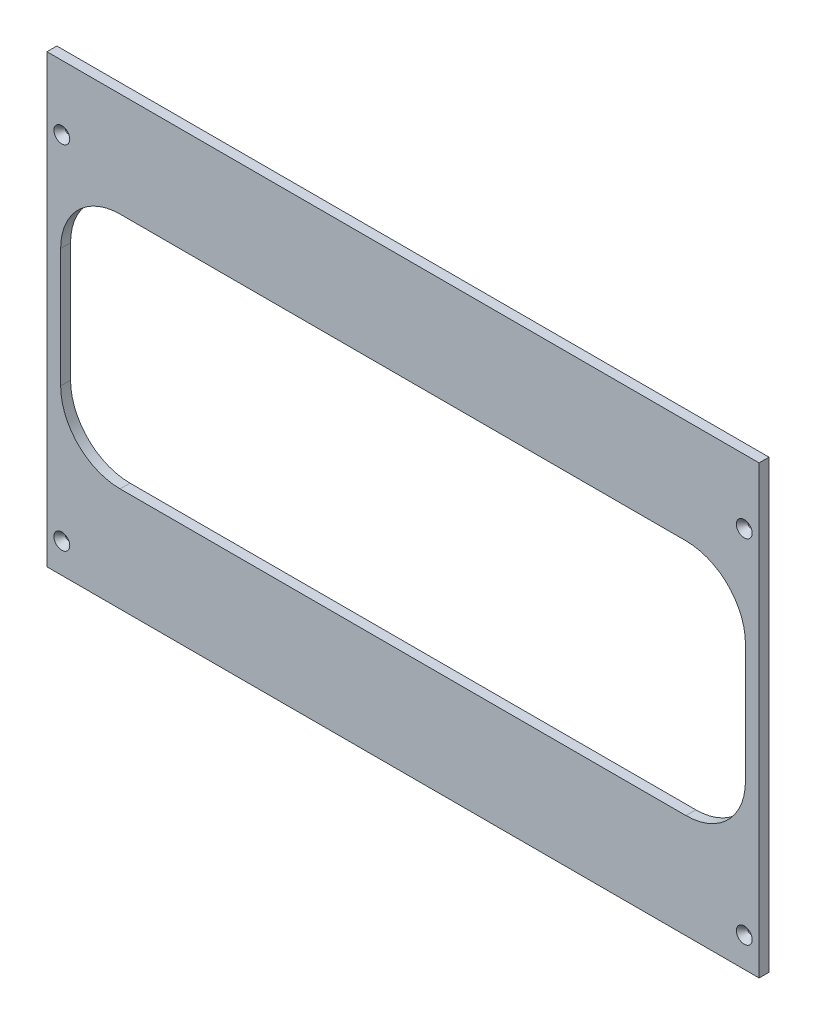
ISO-10303-21;
HEADER;
FILE_DESCRIPTION(('STEP AP214'),'2;1');
FILE_NAME('part.step','',(''),(''),'','','');
FILE_SCHEMA(('AUTOMOTIVE_DESIGN { 1 0 10303 214 1 1 1 1 }'));
ENDSEC;
DATA;
#1=APPLICATION_CONTEXT('core data for automotive mechanical design processes');
#2=APPLICATION_PROTOCOL_DEFINITION('international standard','automotive_design',2000,#1);
#3=PRODUCT_CONTEXT('',#1,'mechanical');
#4=PRODUCT('Part','Part','',(#3));
#5=PRODUCT_RELATED_PRODUCT_CATEGORY('part','',(#4));
#6=PRODUCT_DEFINITION_FORMATION('','',#4);
#7=PRODUCT_DEFINITION_CONTEXT('part definition',#1,'design');
#8=PRODUCT_DEFINITION('design','',#6,#7);
#9=PRODUCT_DEFINITION_SHAPE('','',#8);
#10=(LENGTH_UNIT() NAMED_UNIT(*) SI_UNIT(.MILLI.,.METRE.));
#11=(NAMED_UNIT(*) PLANE_ANGLE_UNIT() SI_UNIT($,.RADIAN.));
#12=(NAMED_UNIT(*) SI_UNIT($,.STERADIAN.) SOLID_ANGLE_UNIT());
#13=UNCERTAINTY_MEASURE_WITH_UNIT(LENGTH_MEASURE(1.E-05),#10,'distance_accuracy_value','');
#14=(GEOMETRIC_REPRESENTATION_CONTEXT(3) GLOBAL_UNCERTAINTY_ASSIGNED_CONTEXT((#13)) GLOBAL_UNIT_ASSIGNED_CONTEXT((#10,
#11,#12)) REPRESENTATION_CONTEXT('',''));
#15=CARTESIAN_POINT('',(0.,0.,0.));
#16=DIRECTION('',(0.,0.,1.));
#17=DIRECTION('',(1.,0.,0.));
#18=AXIS2_PLACEMENT_3D('',#15,#16,#17);
#19=CARTESIAN_POINT('',(-228.088766336441,1.74426445509468E-12,6.35));
#20=DIRECTION('',(1.,0.,0.));
#21=DIRECTION('',(0.,1.,0.));
#22=AXIS2_PLACEMENT_3D('',#19,#20,#21);
#23=PLANE('',#22);
#24=DIRECTION('',(0.,-1.,0.));
#25=VECTOR('',#24,1.);
#26=CARTESIAN_POINT('',(-228.088766336441,1.74426445509468E-12,0.));
#27=LINE('',#26,#25);
#28=CARTESIAN_POINT('',(-228.088766336441,1.74426445509468E-12,0.));
#29=VERTEX_POINT('',#28);
#30=CARTESIAN_POINT('',(-228.088766336441,-285.75,0.));
#31=VERTEX_POINT('',#30);
#32=EDGE_CURVE('E147',#29,#31,#27,.T.);
#33=ORIENTED_EDGE('',*,*,#32,.T.);
#34=DIRECTION('',(0.,0.,-1.));
#35=VECTOR('',#34,1.);
#36=CARTESIAN_POINT('',(-228.088766336441,-285.75,6.35));
#37=LINE('',#36,#35);
#38=CARTESIAN_POINT('',(-228.088766336441,-285.75,6.35));
#39=VERTEX_POINT('',#38);
#40=EDGE_CURVE('E128',#39,#31,#37,.T.);
#41=ORIENTED_EDGE('',*,*,#40,.F.);
#42=DIRECTION('',(0.,-1.,0.));
#43=VECTOR('',#42,1.);
#44=CARTESIAN_POINT('',(-228.088766336441,1.74426445509468E-12,6.35));
#45=LINE('',#44,#43);
#46=CARTESIAN_POINT('',(-228.088766336441,1.74426445509468E-12,6.35));
#47=VERTEX_POINT('',#46);
#48=EDGE_CURVE('E135',#47,#39,#45,.T.);
#49=ORIENTED_EDGE('',*,*,#48,.F.);
#50=DIRECTION('',(0.,0.,-1.));
#51=VECTOR('',#50,1.);
#52=CARTESIAN_POINT('',(-228.088766336441,1.74426445509468E-12,6.35));
#53=LINE('',#52,#51);
#54=EDGE_CURVE('E240',#47,#29,#53,.T.);
#55=ORIENTED_EDGE('',*,*,#54,.T.);
#56=EDGE_LOOP('',(#33,#41,#49,#55));
#57=FACE_BOUND('',#56,.T.);
#58=ADVANCED_FACE('F33',(#57),#23,.F.);
#59=CARTESIAN_POINT('',(-228.088766336441,-285.75,6.35));
#60=DIRECTION('',(0.,1.,0.));
#61=DIRECTION('',(0.,0.,1.));
#62=AXIS2_PLACEMENT_3D('',#59,#60,#61);
#63=PLANE('',#62);
#64=DIRECTION('',(1.,0.,0.));
#65=VECTOR('',#64,1.);
#66=CARTESIAN_POINT('',(-228.088766336441,-285.75,0.));
#67=LINE('',#66,#65);
#68=CARTESIAN_POINT('',(228.088766336441,-285.75,0.));
#69=VERTEX_POINT('',#68);
#70=EDGE_CURVE('E242',#31,#69,#67,.T.);
#71=ORIENTED_EDGE('',*,*,#70,.T.);
#72=DIRECTION('',(0.,0.,-1.));
#73=VECTOR('',#72,1.);
#74=CARTESIAN_POINT('',(228.088766336441,-285.75,6.35));
#75=LINE('',#74,#73);
#76=CARTESIAN_POINT('',(228.088766336441,-285.75,6.35));
#77=VERTEX_POINT('',#76);
#78=EDGE_CURVE('E131',#77,#69,#75,.T.);
#79=ORIENTED_EDGE('',*,*,#78,.F.);
#80=DIRECTION('',(1.,0.,0.));
#81=VECTOR('',#80,1.);
#82=CARTESIAN_POINT('',(-228.088766336441,-285.75,6.35));
#83=LINE('',#82,#81);
#84=EDGE_CURVE('E124',#39,#77,#83,.T.);
#85=ORIENTED_EDGE('',*,*,#84,.F.);
#86=ORIENTED_EDGE('',*,*,#40,.T.);
#87=EDGE_LOOP('',(#71,#79,#85,#86));
#88=FACE_BOUND('',#87,.T.);
#89=ADVANCED_FACE('F126',(#88),#63,.F.);
#90=CARTESIAN_POINT('',(228.088766336441,1.74426445509468E-12,6.35));
#91=DIRECTION('',(-1.,0.,0.));
#92=DIRECTION('',(0.,-1.,0.));
#93=AXIS2_PLACEMENT_3D('',#90,#91,#92);
#94=PLANE('',#93);
#95=DIRECTION('',(0.,1.,0.));
#96=VECTOR('',#95,1.);
#97=CARTESIAN_POINT('',(228.088766336441,1.74426445509468E-12,0.));
#98=LINE('',#97,#96);
#99=CARTESIAN_POINT('',(228.088766336441,1.74426445509468E-12,0.));
#100=VERTEX_POINT('',#99);
#101=EDGE_CURVE('E244',#69,#100,#98,.T.);
#102=ORIENTED_EDGE('',*,*,#101,.T.);
#103=DIRECTION('',(0.,0.,-1.));
#104=VECTOR('',#103,1.);
#105=CARTESIAN_POINT('',(228.088766336441,1.74426445509468E-12,6.35));
#106=LINE('',#105,#104);
#107=CARTESIAN_POINT('',(228.088766336441,1.74426445509468E-12,6.35));
#108=VERTEX_POINT('',#107);
#109=EDGE_CURVE('E152',#108,#100,#106,.T.);
#110=ORIENTED_EDGE('',*,*,#109,.F.);
#111=DIRECTION('',(0.,1.,0.));
#112=VECTOR('',#111,1.);
#113=CARTESIAN_POINT('',(228.088766336441,1.74426445509468E-12,6.35));
#114=LINE('',#113,#112);
#115=EDGE_CURVE('E134',#77,#108,#114,.T.);
#116=ORIENTED_EDGE('',*,*,#115,.F.);
#117=ORIENTED_EDGE('',*,*,#78,.T.);
#118=EDGE_LOOP('',(#102,#110,#116,#117));
#119=FACE_BOUND('',#118,.T.);
#120=ADVANCED_FACE('F256',(#119),#94,.F.);
#121=CARTESIAN_POINT('',(-228.088766336441,1.74426445509468E-12,6.35));
#122=DIRECTION('',(0.,-1.,0.));
#123=DIRECTION('',(0.,0.,-1.));
#124=AXIS2_PLACEMENT_3D('',#121,#122,#123);
#125=PLANE('',#124);
#126=DIRECTION('',(-1.,0.,0.));
#127=VECTOR('',#126,1.);
#128=CARTESIAN_POINT('',(-228.088766336441,1.74426445509468E-12,0.));
#129=LINE('',#128,#127);
#130=EDGE_CURVE('E144',#100,#29,#129,.T.);
#131=ORIENTED_EDGE('',*,*,#130,.T.);
#132=ORIENTED_EDGE('',*,*,#54,.F.);
#133=DIRECTION('',(-1.,0.,0.));
#134=VECTOR('',#133,1.);
#135=CARTESIAN_POINT('',(-228.088766336441,1.74426445509468E-12,6.35));
#136=LINE('',#135,#134);
#137=EDGE_CURVE('E140',#108,#47,#136,.T.);
#138=ORIENTED_EDGE('',*,*,#137,.F.);
#139=ORIENTED_EDGE('',*,*,#109,.T.);
#140=EDGE_LOOP('',(#131,#132,#138,#139));
#141=FACE_BOUND('',#140,.T.);
#142=ADVANCED_FACE('F251',(#141),#125,.F.);
#143=CARTESIAN_POINT('',(0.,0.,6.35));
#144=DIRECTION('',(0.,0.,1.));
#145=DIRECTION('',(1.,0.,0.));
#146=AXIS2_PLACEMENT_3D('',#143,#144,#145);
#147=PLANE('',#146);
#148=CARTESIAN_POINT('',(-218.563766336441,-266.700000000001,6.35));
#149=DIRECTION('',(0.,0.,1.));
#150=DIRECTION('',(1.,0.,0.));
#151=AXIS2_PLACEMENT_3D('',#148,#149,#150);
#152=CIRCLE('',#151,5.08);
#153=CARTESIAN_POINT('',(-213.483766336441,-266.700000000001,6.35));
#154=VERTEX_POINT('',#153);
#155=EDGE_CURVE('E364',#154,#154,#152,.T.);
#156=ORIENTED_EDGE('',*,*,#155,.F.);
#157=EDGE_LOOP('',(#156));
#158=FACE_BOUND('',#157,.T.);
#159=CARTESIAN_POINT('',(-218.563766336441,-41.275,6.35));
#160=DIRECTION('',(0.,0.,1.));
#161=DIRECTION('',(1.,0.,0.));
#162=AXIS2_PLACEMENT_3D('',#159,#160,#161);
#163=CIRCLE('',#162,5.08);
#164=CARTESIAN_POINT('',(-213.483766336441,-41.275,6.35));
#165=VERTEX_POINT('',#164);
#166=EDGE_CURVE('E202',#165,#165,#163,.T.);
#167=ORIENTED_EDGE('',*,*,#166,.F.);
#168=EDGE_LOOP('',(#167));
#169=FACE_BOUND('',#168,.T.);
#170=CARTESIAN_POINT('',(218.563766336441,-266.700000000001,6.35));
#171=DIRECTION('',(0.,0.,1.));
#172=DIRECTION('',(1.,0.,0.));
#173=AXIS2_PLACEMENT_3D('',#170,#171,#172);
#174=CIRCLE('',#173,5.08);
#175=CARTESIAN_POINT('',(223.643766336441,-266.700000000001,6.35));
#176=VERTEX_POINT('',#175);
#177=EDGE_CURVE('E195',#176,#176,#174,.T.);
#178=ORIENTED_EDGE('',*,*,#177,.F.);
#179=EDGE_LOOP('',(#178));
#180=FACE_BOUND('',#179,.T.);
#181=CARTESIAN_POINT('',(218.563766336441,-41.275,6.35));
#182=DIRECTION('',(0.,0.,1.));
#183=DIRECTION('',(1.,0.,0.));
#184=AXIS2_PLACEMENT_3D('',#181,#182,#183);
#185=CIRCLE('',#184,5.08);
#186=CARTESIAN_POINT('',(223.643766336441,-41.275,6.35));
#187=VERTEX_POINT('',#186);
#188=EDGE_CURVE('E191',#187,#187,#185,.T.);
#189=ORIENTED_EDGE('',*,*,#188,.F.);
#190=EDGE_LOOP('',(#189));
#191=FACE_BOUND('',#190,.T.);
#192=DIRECTION('',(0.,1.,0.));
#193=VECTOR('',#192,1.);
#194=CARTESIAN_POINT('',(219.325766336441,-219.075,6.35));
#195=LINE('',#194,#193);
#196=CARTESIAN_POINT('',(219.325766336441,-180.975,6.35));
#197=VERTEX_POINT('',#196);
#198=CARTESIAN_POINT('',(219.325766336441,-104.775,6.35));
#199=VERTEX_POINT('',#198);
#200=EDGE_CURVE('E224',#197,#199,#195,.T.);
#201=ORIENTED_EDGE('',*,*,#200,.F.);
#202=CARTESIAN_POINT('',(181.225766336441,-180.975,6.35));
#203=DIRECTION('',(0.,0.,1.));
#204=DIRECTION('',(1.,0.,0.));
#205=AXIS2_PLACEMENT_3D('',#202,#203,#204);
#206=CIRCLE('',#205,38.1);
#207=CARTESIAN_POINT('',(181.225766336441,-219.075,6.35));
#208=VERTEX_POINT('',#207);
#209=EDGE_CURVE('E176',#197,#208,#206,.F.);
#210=ORIENTED_EDGE('',*,*,#209,.T.);
#211=DIRECTION('',(1.,0.,0.));
#212=VECTOR('',#211,1.);
#213=CARTESIAN_POINT('',(-219.325766336441,-219.075,6.35));
#214=LINE('',#213,#212);
#215=CARTESIAN_POINT('',(-181.225766336441,-219.075,6.35));
#216=VERTEX_POINT('',#215);
#217=EDGE_CURVE('E232',#216,#208,#214,.T.);
#218=ORIENTED_EDGE('',*,*,#217,.F.);
#219=CARTESIAN_POINT('',(-181.225766336441,-180.975,6.35));
#220=DIRECTION('',(0.,0.,1.));
#221=DIRECTION('',(1.,0.,0.));
#222=AXIS2_PLACEMENT_3D('',#219,#220,#221);
#223=CIRCLE('',#222,38.1);
#224=CARTESIAN_POINT('',(-219.325766336441,-180.975,6.35));
#225=VERTEX_POINT('',#224);
#226=EDGE_CURVE('E50',#216,#225,#223,.F.);
#227=ORIENTED_EDGE('',*,*,#226,.T.);
#228=DIRECTION('',(0.,-1.,0.));
#229=VECTOR('',#228,1.);
#230=CARTESIAN_POINT('',(-219.325766336441,-219.075,6.35));
#231=LINE('',#230,#229);
#232=CARTESIAN_POINT('',(-219.325766336441,-104.775,6.35));
#233=VERTEX_POINT('',#232);
#234=EDGE_CURVE('E230',#233,#225,#231,.T.);
#235=ORIENTED_EDGE('',*,*,#234,.F.);
#236=CARTESIAN_POINT('',(-181.225766336441,-104.775,6.35));
#237=DIRECTION('',(0.,0.,1.));
#238=DIRECTION('',(1.,0.,0.));
#239=AXIS2_PLACEMENT_3D('',#236,#237,#238);
#240=CIRCLE('',#239,38.1);
#241=CARTESIAN_POINT('',(-181.225766336441,-66.675,6.35));
#242=VERTEX_POINT('',#241);
#243=EDGE_CURVE('E42',#233,#242,#240,.F.);
#244=ORIENTED_EDGE('',*,*,#243,.T.);
#245=DIRECTION('',(-1.,0.,0.));
#246=VECTOR('',#245,1.);
#247=CARTESIAN_POINT('',(-219.325766336441,-66.675,6.35));
#248=LINE('',#247,#246);
#249=CARTESIAN_POINT('',(181.225766336441,-66.675,6.35));
#250=VERTEX_POINT('',#249);
#251=EDGE_CURVE('E227',#250,#242,#248,.T.);
#252=ORIENTED_EDGE('',*,*,#251,.F.);
#253=CARTESIAN_POINT('',(181.225766336441,-104.775,6.35));
#254=DIRECTION('',(0.,0.,1.));
#255=DIRECTION('',(1.,0.,0.));
#256=AXIS2_PLACEMENT_3D('',#253,#254,#255);
#257=CIRCLE('',#256,38.1);
#258=EDGE_CURVE('E172',#250,#199,#257,.F.);
#259=ORIENTED_EDGE('',*,*,#258,.T.);
#260=EDGE_LOOP('',(#201,#210,#218,#227,#235,#244,#252,#259));
#261=FACE_BOUND('',#260,.T.);
#262=ORIENTED_EDGE('',*,*,#48,.T.);
#263=ORIENTED_EDGE('',*,*,#84,.T.);
#264=ORIENTED_EDGE('',*,*,#115,.T.);
#265=ORIENTED_EDGE('',*,*,#137,.T.);
#266=EDGE_LOOP('',(#262,#263,#264,#265));
#267=FACE_BOUND('',#266,.T.);
#268=ADVANCED_FACE('F138',(#158,#169,#180,#191,#261,#267),#147,.T.);
#269=CARTESIAN_POINT('',(0.,0.,0.));
#270=DIRECTION('',(0.,0.,1.));
#271=DIRECTION('',(1.,0.,0.));
#272=AXIS2_PLACEMENT_3D('',#269,#270,#271);
#273=PLANE('',#272);
#274=CARTESIAN_POINT('',(-218.563766336441,-266.700000000001,0.));
#275=DIRECTION('',(0.,0.,1.));
#276=DIRECTION('',(1.,0.,0.));
#277=AXIS2_PLACEMENT_3D('',#274,#275,#276);
#278=CIRCLE('',#277,1.58749999999999);
#279=CARTESIAN_POINT('',(-216.976266336441,-266.700000000001,0.));
#280=VERTEX_POINT('',#279);
#281=EDGE_CURVE('E37',#280,#280,#278,.T.);
#282=ORIENTED_EDGE('',*,*,#281,.T.);
#283=EDGE_LOOP('',(#282));
#284=FACE_BOUND('',#283,.T.);
#285=CARTESIAN_POINT('',(-218.563766336441,-41.275,0.));
#286=DIRECTION('',(0.,0.,1.));
#287=DIRECTION('',(1.,0.,0.));
#288=AXIS2_PLACEMENT_3D('',#285,#286,#287);
#289=CIRCLE('',#288,1.58749999999999);
#290=CARTESIAN_POINT('',(-216.976266336441,-41.275,0.));
#291=VERTEX_POINT('',#290);
#292=EDGE_CURVE('E193',#291,#291,#289,.T.);
#293=ORIENTED_EDGE('',*,*,#292,.T.);
#294=EDGE_LOOP('',(#293));
#295=FACE_BOUND('',#294,.T.);
#296=CARTESIAN_POINT('',(218.563766336441,-266.700000000001,0.));
#297=DIRECTION('',(0.,0.,1.));
#298=DIRECTION('',(1.,0.,0.));
#299=AXIS2_PLACEMENT_3D('',#296,#297,#298);
#300=CIRCLE('',#299,1.58749999999999);
#301=CARTESIAN_POINT('',(220.151266336441,-266.700000000001,0.));
#302=VERTEX_POINT('',#301);
#303=EDGE_CURVE('E189',#302,#302,#300,.T.);
#304=ORIENTED_EDGE('',*,*,#303,.T.);
#305=EDGE_LOOP('',(#304));
#306=FACE_BOUND('',#305,.T.);
#307=CARTESIAN_POINT('',(218.563766336441,-41.275,0.));
#308=DIRECTION('',(0.,0.,1.));
#309=DIRECTION('',(1.,0.,0.));
#310=AXIS2_PLACEMENT_3D('',#307,#308,#309);
#311=CIRCLE('',#310,1.58749999999999);
#312=CARTESIAN_POINT('',(220.151266336441,-41.275,0.));
#313=VERTEX_POINT('',#312);
#314=EDGE_CURVE('E184',#313,#313,#311,.T.);
#315=ORIENTED_EDGE('',*,*,#314,.T.);
#316=EDGE_LOOP('',(#315));
#317=FACE_BOUND('',#316,.T.);
#318=DIRECTION('',(-1.,0.,0.));
#319=VECTOR('',#318,1.);
#320=CARTESIAN_POINT('',(-219.325766336441,-219.075,0.));
#321=LINE('',#320,#319);
#322=CARTESIAN_POINT('',(181.225766336441,-219.075,0.));
#323=VERTEX_POINT('',#322);
#324=CARTESIAN_POINT('',(-181.225766336441,-219.075,0.));
#325=VERTEX_POINT('',#324);
#326=EDGE_CURVE('E218',#323,#325,#321,.T.);
#327=ORIENTED_EDGE('',*,*,#326,.F.);
#328=CARTESIAN_POINT('',(181.225766336441,-180.975,0.));
#329=DIRECTION('',(0.,0.,1.));
#330=DIRECTION('',(1.,0.,0.));
#331=AXIS2_PLACEMENT_3D('',#328,#329,#330);
#332=CIRCLE('',#331,38.1);
#333=CARTESIAN_POINT('',(219.325766336441,-180.975,0.));
#334=VERTEX_POINT('',#333);
#335=EDGE_CURVE('E178',#323,#334,#332,.T.);
#336=ORIENTED_EDGE('',*,*,#335,.T.);
#337=DIRECTION('',(0.,-1.,0.));
#338=VECTOR('',#337,1.);
#339=CARTESIAN_POINT('',(219.325766336441,-219.075,0.));
#340=LINE('',#339,#338);
#341=CARTESIAN_POINT('',(219.325766336441,-104.775,0.));
#342=VERTEX_POINT('',#341);
#343=EDGE_CURVE('E221',#342,#334,#340,.T.);
#344=ORIENTED_EDGE('',*,*,#343,.F.);
#345=CARTESIAN_POINT('',(181.225766336441,-104.775,0.));
#346=DIRECTION('',(0.,0.,1.));
#347=DIRECTION('',(1.,0.,0.));
#348=AXIS2_PLACEMENT_3D('',#345,#346,#347);
#349=CIRCLE('',#348,38.1);
#350=CARTESIAN_POINT('',(181.225766336441,-66.675,0.));
#351=VERTEX_POINT('',#350);
#352=EDGE_CURVE('E174',#342,#351,#349,.T.);
#353=ORIENTED_EDGE('',*,*,#352,.T.);
#354=DIRECTION('',(1.,0.,0.));
#355=VECTOR('',#354,1.);
#356=CARTESIAN_POINT('',(-219.325766336441,-66.675,0.));
#357=LINE('',#356,#355);
#358=CARTESIAN_POINT('',(-181.225766336441,-66.675,0.));
#359=VERTEX_POINT('',#358);
#360=EDGE_CURVE('E235',#359,#351,#357,.T.);
#361=ORIENTED_EDGE('',*,*,#360,.F.);
#362=CARTESIAN_POINT('',(-181.225766336441,-104.775,0.));
#363=DIRECTION('',(0.,0.,1.));
#364=DIRECTION('',(1.,0.,0.));
#365=AXIS2_PLACEMENT_3D('',#362,#363,#364);
#366=CIRCLE('',#365,38.1);
#367=CARTESIAN_POINT('',(-219.325766336441,-104.775,0.));
#368=VERTEX_POINT('',#367);
#369=EDGE_CURVE('E11',#359,#368,#366,.T.);
#370=ORIENTED_EDGE('',*,*,#369,.T.);
#371=DIRECTION('',(0.,1.,0.));
#372=VECTOR('',#371,1.);
#373=CARTESIAN_POINT('',(-219.325766336441,-219.075,0.));
#374=LINE('',#373,#372);
#375=CARTESIAN_POINT('',(-219.325766336441,-180.975,0.));
#376=VERTEX_POINT('',#375);
#377=EDGE_CURVE('E187',#376,#368,#374,.T.);
#378=ORIENTED_EDGE('',*,*,#377,.F.);
#379=CARTESIAN_POINT('',(-181.225766336441,-180.975,0.));
#380=DIRECTION('',(0.,0.,1.));
#381=DIRECTION('',(1.,0.,0.));
#382=AXIS2_PLACEMENT_3D('',#379,#380,#381);
#383=CIRCLE('',#382,38.1);
#384=EDGE_CURVE('E181',#376,#325,#383,.T.);
#385=ORIENTED_EDGE('',*,*,#384,.T.);
#386=EDGE_LOOP('',(#327,#336,#344,#353,#361,#370,#378,#385));
#387=FACE_BOUND('',#386,.T.);
#388=ORIENTED_EDGE('',*,*,#32,.F.);
#389=ORIENTED_EDGE('',*,*,#130,.F.);
#390=ORIENTED_EDGE('',*,*,#101,.F.);
#391=ORIENTED_EDGE('',*,*,#70,.F.);
#392=EDGE_LOOP('',(#388,#389,#390,#391));
#393=FACE_BOUND('',#392,.T.);
#394=ADVANCED_FACE('F255',(#284,#295,#306,#317,#387,#393),#273,.F.);
#395=CARTESIAN_POINT('',(219.325766336441,-219.075,-0.00100000000000013));
#396=DIRECTION('',(1.,0.,0.));
#397=DIRECTION('',(0.,0.,-1.));
#398=AXIS2_PLACEMENT_3D('',#395,#396,#397);
#399=PLANE('',#398);
#400=ORIENTED_EDGE('',*,*,#200,.T.);
#401=DIRECTION('',(0.,0.,1.));
#402=VECTOR('',#401,1.);
#403=CARTESIAN_POINT('',(219.325766336441,-104.775,0.));
#404=LINE('',#403,#402);
#405=EDGE_CURVE('E161',#199,#342,#404,.F.);
#406=ORIENTED_EDGE('',*,*,#405,.T.);
#407=ORIENTED_EDGE('',*,*,#343,.T.);
#408=DIRECTION('',(0.,0.,1.));
#409=VECTOR('',#408,1.);
#410=CARTESIAN_POINT('',(219.325766336441,-180.975,6.35));
#411=LINE('',#410,#409);
#412=EDGE_CURVE('E158',#334,#197,#411,.T.);
#413=ORIENTED_EDGE('',*,*,#412,.T.);
#414=EDGE_LOOP('',(#400,#406,#407,#413));
#415=FACE_BOUND('',#414,.T.);
#416=ADVANCED_FACE('F299',(#415),#399,.F.);
#417=CARTESIAN_POINT('',(-219.325766336441,-219.075,-0.00100000000000013));
#418=DIRECTION('',(0.,-1.,0.));
#419=DIRECTION('',(0.,0.,-1.));
#420=AXIS2_PLACEMENT_3D('',#417,#418,#419);
#421=PLANE('',#420);
#422=ORIENTED_EDGE('',*,*,#217,.T.);
#423=DIRECTION('',(0.,0.,1.));
#424=VECTOR('',#423,1.);
#425=CARTESIAN_POINT('',(181.225766336441,-219.075,0.));
#426=LINE('',#425,#424);
#427=EDGE_CURVE('E166',#208,#323,#426,.F.);
#428=ORIENTED_EDGE('',*,*,#427,.T.);
#429=ORIENTED_EDGE('',*,*,#326,.T.);
#430=DIRECTION('',(0.,0.,1.));
#431=VECTOR('',#430,1.);
#432=CARTESIAN_POINT('',(-181.225766336441,-219.075,6.35));
#433=LINE('',#432,#431);
#434=EDGE_CURVE('E163',#325,#216,#433,.T.);
#435=ORIENTED_EDGE('',*,*,#434,.T.);
#436=EDGE_LOOP('',(#422,#428,#429,#435));
#437=FACE_BOUND('',#436,.T.);
#438=ADVANCED_FACE('F293',(#437),#421,.F.);
#439=CARTESIAN_POINT('',(-219.325766336441,-219.075,-0.00100000000000013));
#440=DIRECTION('',(-1.,0.,0.));
#441=DIRECTION('',(0.,0.,1.));
#442=AXIS2_PLACEMENT_3D('',#439,#440,#441);
#443=PLANE('',#442);
#444=ORIENTED_EDGE('',*,*,#234,.T.);
#445=DIRECTION('',(0.,0.,1.));
#446=VECTOR('',#445,1.);
#447=CARTESIAN_POINT('',(-219.325766336441,-180.975,0.));
#448=LINE('',#447,#446);
#449=EDGE_CURVE('E170',#225,#376,#448,.F.);
#450=ORIENTED_EDGE('',*,*,#449,.T.);
#451=ORIENTED_EDGE('',*,*,#377,.T.);
#452=DIRECTION('',(0.,0.,1.));
#453=VECTOR('',#452,1.);
#454=CARTESIAN_POINT('',(-219.325766336441,-104.775,6.35));
#455=LINE('',#454,#453);
#456=EDGE_CURVE('E168',#368,#233,#455,.T.);
#457=ORIENTED_EDGE('',*,*,#456,.T.);
#458=EDGE_LOOP('',(#444,#450,#451,#457));
#459=FACE_BOUND('',#458,.T.);
#460=ADVANCED_FACE('F308',(#459),#443,.F.);
#461=CARTESIAN_POINT('',(-219.325766336441,-66.675,-0.00100000000000013));
#462=DIRECTION('',(0.,1.,0.));
#463=DIRECTION('',(0.,0.,1.));
#464=AXIS2_PLACEMENT_3D('',#461,#462,#463);
#465=PLANE('',#464);
#466=ORIENTED_EDGE('',*,*,#360,.T.);
#467=DIRECTION('',(0.,0.,1.));
#468=VECTOR('',#467,1.);
#469=CARTESIAN_POINT('',(181.225766336441,-66.675,6.35));
#470=LINE('',#469,#468);
#471=EDGE_CURVE('E150',#351,#250,#470,.T.);
#472=ORIENTED_EDGE('',*,*,#471,.T.);
#473=ORIENTED_EDGE('',*,*,#251,.T.);
#474=DIRECTION('',(0.,0.,1.));
#475=VECTOR('',#474,1.);
#476=CARTESIAN_POINT('',(-181.225766336441,-66.675,0.));
#477=LINE('',#476,#475);
#478=EDGE_CURVE('E148',#242,#359,#477,.F.);
#479=ORIENTED_EDGE('',*,*,#478,.T.);
#480=EDGE_LOOP('',(#466,#472,#473,#479));
#481=FACE_BOUND('',#480,.T.);
#482=ADVANCED_FACE('F274',(#481),#465,.F.);
#483=CARTESIAN_POINT('',(181.225766336441,-104.775,-0.00100000000000013));
#484=DIRECTION('',(0.,0.,-1.));
#485=DIRECTION('',(-1.,0.,0.));
#486=AXIS2_PLACEMENT_3D('',#483,#484,#485);
#487=CYLINDRICAL_SURFACE('',#486,38.1);
#488=ORIENTED_EDGE('',*,*,#352,.F.);
#489=ORIENTED_EDGE('',*,*,#405,.F.);
#490=ORIENTED_EDGE('',*,*,#258,.F.);
#491=ORIENTED_EDGE('',*,*,#471,.F.);
#492=EDGE_LOOP('',(#488,#489,#490,#491));
#493=FACE_BOUND('',#492,.T.);
#494=ADVANCED_FACE('F270',(#493),#487,.F.);
#495=CARTESIAN_POINT('',(181.225766336441,-180.975,-0.00100000000000013));
#496=DIRECTION('',(0.,0.,-1.));
#497=DIRECTION('',(-1.,0.,0.));
#498=AXIS2_PLACEMENT_3D('',#495,#496,#497);
#499=CYLINDRICAL_SURFACE('',#498,38.1);
#500=ORIENTED_EDGE('',*,*,#335,.F.);
#501=ORIENTED_EDGE('',*,*,#427,.F.);
#502=ORIENTED_EDGE('',*,*,#209,.F.);
#503=ORIENTED_EDGE('',*,*,#412,.F.);
#504=EDGE_LOOP('',(#500,#501,#502,#503));
#505=FACE_BOUND('',#504,.T.);
#506=ADVANCED_FACE('F273',(#505),#499,.F.);
#507=CARTESIAN_POINT('',(-181.225766336441,-180.975,-0.00100000000000013));
#508=DIRECTION('',(0.,0.,-1.));
#509=DIRECTION('',(-1.,0.,0.));
#510=AXIS2_PLACEMENT_3D('',#507,#508,#509);
#511=CYLINDRICAL_SURFACE('',#510,38.1);
#512=ORIENTED_EDGE('',*,*,#384,.F.);
#513=ORIENTED_EDGE('',*,*,#449,.F.);
#514=ORIENTED_EDGE('',*,*,#226,.F.);
#515=ORIENTED_EDGE('',*,*,#434,.F.);
#516=EDGE_LOOP('',(#512,#513,#514,#515));
#517=FACE_BOUND('',#516,.T.);
#518=ADVANCED_FACE('F277',(#517),#511,.F.);
#519=CARTESIAN_POINT('',(-181.225766336441,-104.775,-0.00100000000000013));
#520=DIRECTION('',(0.,0.,-1.));
#521=DIRECTION('',(-1.,0.,0.));
#522=AXIS2_PLACEMENT_3D('',#519,#520,#521);
#523=CYLINDRICAL_SURFACE('',#522,38.1);
#524=ORIENTED_EDGE('',*,*,#369,.F.);
#525=ORIENTED_EDGE('',*,*,#478,.F.);
#526=ORIENTED_EDGE('',*,*,#243,.F.);
#527=ORIENTED_EDGE('',*,*,#456,.F.);
#528=EDGE_LOOP('',(#524,#525,#526,#527));
#529=FACE_BOUND('',#528,.T.);
#530=ADVANCED_FACE('F35',(#529),#523,.F.);
#531=CARTESIAN_POINT('',(218.563766336441,-41.275,6.35));
#532=DIRECTION('',(0.,0.,1.));
#533=DIRECTION('',(1.,0.,0.));
#534=AXIS2_PLACEMENT_3D('',#531,#532,#533);
#535=CYLINDRICAL_SURFACE('',#534,1.58749999999999);
#536=CARTESIAN_POINT('',(218.563766336441,-41.275,2.33233833778065));
#537=DIRECTION('',(0.,0.,1.));
#538=DIRECTION('',(1.,0.,0.));
#539=AXIS2_PLACEMENT_3D('',#536,#537,#538);
#540=CIRCLE('',#539,1.58749999999999);
#541=CARTESIAN_POINT('',(220.151266336441,-41.275,2.33233833778065));
#542=VERTEX_POINT('',#541);
#543=EDGE_CURVE('E188',#542,#542,#540,.T.);
#544=ORIENTED_EDGE('',*,*,#543,.T.);
#545=EDGE_LOOP('',(#544));
#546=FACE_BOUND('',#545,.T.);
#547=ORIENTED_EDGE('',*,*,#314,.F.);
#548=EDGE_LOOP('',(#547));
#549=FACE_BOUND('',#548,.T.);
#550=ADVANCED_FACE('F284',(#546,#549),#535,.F.);
#551=CARTESIAN_POINT('',(218.563766336441,-41.275,6.35));
#552=DIRECTION('',(0.,0.,1.));
#553=DIRECTION('',(1.,0.,0.));
#554=AXIS2_PLACEMENT_3D('',#551,#552,#553);
#555=CONICAL_SURFACE('',#554,5.08,0.715584993317679);
#556=CARTESIAN_POINT('',(220.151266336441,-41.275,2.33233833778065));
#557=CARTESIAN_POINT('',(220.187646544774,-41.275,2.37418898009543));
#558=CARTESIAN_POINT('',(220.224026753108,-41.275,2.41603962241021));
#559=CARTESIAN_POINT('',(220.296787169774,-41.275,2.49974090703979));
#560=CARTESIAN_POINT('',(220.333167378108,-41.275,2.54159154935457));
#561=CARTESIAN_POINT('',(220.405927794774,-41.275,2.62529283398414));
#562=CARTESIAN_POINT('',(220.442308003108,-41.275,2.66714347629892));
#563=CARTESIAN_POINT('',(220.515068419774,-41.275,2.75084476092849));
#564=CARTESIAN_POINT('',(220.551448628108,-41.275,2.79269540324328));
#565=CARTESIAN_POINT('',(220.624209044774,-41.275,2.87639668787285));
#566=CARTESIAN_POINT('',(220.660589253108,-41.275,2.91824733018764));
#567=CARTESIAN_POINT('',(220.733349669774,-41.275,3.0019486148172));
#568=CARTESIAN_POINT('',(220.769729878108,-41.275,3.04379925713199));
#569=CARTESIAN_POINT('',(220.842490294774,-41.275,3.12750054176156));
#570=CARTESIAN_POINT('',(220.878870503108,-41.275,3.16935118407634));
#571=CARTESIAN_POINT('',(220.951630919774,-41.275,3.25305246870591));
#572=CARTESIAN_POINT('',(220.988011128108,-41.275,3.2949031110207));
#573=CARTESIAN_POINT('',(221.060771544774,-41.275,3.37860439565027));
#574=CARTESIAN_POINT('',(221.097151753108,-41.275,3.42045503796505));
#575=CARTESIAN_POINT('',(221.169912169774,-41.275,3.50415632259462));
#576=CARTESIAN_POINT('',(221.206292378108,-41.275,3.54600696490941));
#577=CARTESIAN_POINT('',(221.279052794774,-41.275,3.62970824953898));
#578=CARTESIAN_POINT('',(221.315433003108,-41.275,3.67155889185376));
#579=CARTESIAN_POINT('',(221.388193419774,-41.275,3.75526017648333));
#580=CARTESIAN_POINT('',(221.424573628108,-41.275,3.79711081879812));
#581=CARTESIAN_POINT('',(221.497334044774,-41.275,3.88081210342769));
#582=CARTESIAN_POINT('',(221.533714253108,-41.275,3.92266274574247));
#583=CARTESIAN_POINT('',(221.606474669774,-41.275,4.00636403037204));
#584=CARTESIAN_POINT('',(221.642854878108,-41.275,4.04821467268683));
#585=CARTESIAN_POINT('',(221.715615294774,-41.275,4.1319159573164));
#586=CARTESIAN_POINT('',(221.751995503108,-41.275,4.17376659963118));
#587=CARTESIAN_POINT('',(221.824755919774,-41.275,4.25746788426075));
#588=CARTESIAN_POINT('',(221.861136128108,-41.275,4.29931852657554));
#589=CARTESIAN_POINT('',(221.933896544774,-41.275,4.38301981120511));
#590=CARTESIAN_POINT('',(221.970276753108,-41.275,4.42487045351989));
#591=CARTESIAN_POINT('',(222.043037169774,-41.275,4.50857173814946));
#592=CARTESIAN_POINT('',(222.079417378108,-41.275,4.55042238046425));
#593=CARTESIAN_POINT('',(222.152177794774,-41.275,4.63412366509382));
#594=CARTESIAN_POINT('',(222.188558003108,-41.275,4.6759743074086));
#595=CARTESIAN_POINT('',(222.261318419774,-41.275,4.75967559203817));
#596=CARTESIAN_POINT('',(222.297698628108,-41.275,4.80152623435296));
#597=CARTESIAN_POINT('',(222.370459044774,-41.275,4.88522751898253));
#598=CARTESIAN_POINT('',(222.406839253108,-41.275,4.92707816129731));
#599=CARTESIAN_POINT('',(222.479599669774,-41.275,5.01077944592688));
#600=CARTESIAN_POINT('',(222.515979878108,-41.275,5.05263008824167));
#601=CARTESIAN_POINT('',(222.588740294774,-41.275,5.13633137287124));
#602=CARTESIAN_POINT('',(222.625120503108,-41.275,5.17818201518602));
#603=CARTESIAN_POINT('',(222.697880919774,-41.275,5.26188329981559));
#604=CARTESIAN_POINT('',(222.734261128108,-41.275,5.30373394213038));
#605=CARTESIAN_POINT('',(222.807021544774,-41.275,5.38743522675995));
#606=CARTESIAN_POINT('',(222.843401753108,-41.275,5.42928586907473));
#607=CARTESIAN_POINT('',(222.916162169774,-41.275,5.5129871537043));
#608=CARTESIAN_POINT('',(222.952542378108,-41.275,5.55483779601909));
#609=CARTESIAN_POINT('',(223.025302794774,-41.275,5.63853908064866));
#610=CARTESIAN_POINT('',(223.061683003108,-41.275,5.68038972296344));
#611=CARTESIAN_POINT('',(223.134443419774,-41.275,5.76409100759301));
#612=CARTESIAN_POINT('',(223.170823628108,-41.275,5.80594164990779));
#613=CARTESIAN_POINT('',(223.243584044774,-41.275,5.88964293453737));
#614=CARTESIAN_POINT('',(223.279964253108,-41.275,5.93149357685215));
#615=CARTESIAN_POINT('',(223.352724669774,-41.275,6.01519486148172));
#616=CARTESIAN_POINT('',(223.389104878108,-41.275,6.05704550379651));
#617=CARTESIAN_POINT('',(223.461865294774,-41.275,6.14074678842608));
#618=CARTESIAN_POINT('',(223.498245503108,-41.275,6.18259743074086));
#619=CARTESIAN_POINT('',(223.571005919774,-41.275,6.26629871537043));
#620=CARTESIAN_POINT('',(223.607386128108,-41.275,6.30814935768522));
#621=CARTESIAN_POINT('',(223.643766336441,-41.275,6.35));
#622=B_SPLINE_CURVE_WITH_KNOTS('',3,(#556,#557,#558,#559,#560,#561,#562,#563,#564,#565,#566,
#567,#568,#569,#570,#571,#572,#573,#574,#575,#576,#577,#578,#579,#580,#581,#582,#583,#584,#585,
#586,#587,#588,#589,#590,#591,#592,#593,#594,#595,#596,#597,#598,#599,#600,#601,#602,#603,#604,
#605,#606,#607,#608,#609,#610,#611,#612,#613,#614,#615,#616,#617,#618,#619,#620,#621),
.UNSPECIFIED.,.F.,.F.,(4,2,2,2,2,2,2,2,2,2,2,2,2,2,2,2,2,2,2,2,2,2,2,2,2,2,2,2,2,2,2,2,4),(0.,
0.166357934541254,0.332715869082507,0.499073803623761,0.665431738164997,0.831789672706251,
0.998147607247505,1.16450554178876,1.33086347633001,1.49722141087127,1.66357934541252,
1.82993727995377,1.99629521449501,2.16265314903626,2.32901108357752,2.49536901811877,
2.66172695266002,2.82808488720128,2.99444282174253,3.16080075628378,3.32715869082502,
3.49351662536627,3.65987455990753,3.82623249444878,3.99259042899003,4.15894836353129,
4.32530629807254,4.49166423261379,4.65802216715505,4.82438010169628,4.99073803623754,
5.15709597077879,5.32345390532005),.UNSPECIFIED.);
#623=EDGE_CURVE('BSEAM330',#542,#187,#622,.T.);
#624=ORIENTED_EDGE('',*,*,#543,.F.);
#625=ORIENTED_EDGE('',*,*,#188,.T.);
#626=ORIENTED_EDGE('',*,*,#623,.T.);
#627=ORIENTED_EDGE('',*,*,#623,.F.);
#628=EDGE_LOOP('',(#624,#626,#625,#627));
#629=FACE_BOUND('',#628,.T.);
#630=ADVANCED_FACE('F330',(#629),#555,.F.);
#631=CARTESIAN_POINT('',(218.563766336441,-266.700000000001,6.35));
#632=DIRECTION('',(0.,0.,1.));
#633=DIRECTION('',(1.,0.,0.));
#634=AXIS2_PLACEMENT_3D('',#631,#632,#633);
#635=CYLINDRICAL_SURFACE('',#634,1.58749999999999);
#636=CARTESIAN_POINT('',(218.563766336441,-266.700000000001,2.33233833778065));
#637=DIRECTION('',(0.,0.,1.));
#638=DIRECTION('',(1.,0.,0.));
#639=AXIS2_PLACEMENT_3D('',#636,#637,#638);
#640=CIRCLE('',#639,1.58749999999999);
#641=CARTESIAN_POINT('',(220.151266336441,-266.700000000001,2.33233833778065));
#642=VERTEX_POINT('',#641);
#643=EDGE_CURVE('E192',#642,#642,#640,.T.);
#644=ORIENTED_EDGE('',*,*,#643,.T.);
#645=EDGE_LOOP('',(#644));
#646=FACE_BOUND('',#645,.T.);
#647=ORIENTED_EDGE('',*,*,#303,.F.);
#648=EDGE_LOOP('',(#647));
#649=FACE_BOUND('',#648,.T.);
#650=ADVANCED_FACE('F334',(#646,#649),#635,.F.);
#651=CARTESIAN_POINT('',(218.563766336441,-266.700000000001,6.35));
#652=DIRECTION('',(0.,0.,1.));
#653=DIRECTION('',(1.,0.,0.));
#654=AXIS2_PLACEMENT_3D('',#651,#652,#653);
#655=CONICAL_SURFACE('',#654,5.08,0.715584993317679);
#656=CARTESIAN_POINT('',(220.151266336441,-266.700000000001,2.33233833778065));
#657=CARTESIAN_POINT('',(220.187646544774,-266.700000000001,2.37418898009543));
#658=CARTESIAN_POINT('',(220.224026753108,-266.700000000001,2.41603962241021));
#659=CARTESIAN_POINT('',(220.296787169774,-266.700000000001,2.49974090703979));
#660=CARTESIAN_POINT('',(220.333167378108,-266.700000000001,2.54159154935457));
#661=CARTESIAN_POINT('',(220.405927794774,-266.700000000001,2.62529283398414));
#662=CARTESIAN_POINT('',(220.442308003108,-266.700000000001,2.66714347629892));
#663=CARTESIAN_POINT('',(220.515068419774,-266.700000000001,2.75084476092849));
#664=CARTESIAN_POINT('',(220.551448628108,-266.700000000001,2.79269540324328));
#665=CARTESIAN_POINT('',(220.624209044774,-266.700000000001,2.87639668787285));
#666=CARTESIAN_POINT('',(220.660589253108,-266.700000000001,2.91824733018764));
#667=CARTESIAN_POINT('',(220.733349669774,-266.700000000001,3.0019486148172));
#668=CARTESIAN_POINT('',(220.769729878108,-266.700000000001,3.04379925713199));
#669=CARTESIAN_POINT('',(220.842490294774,-266.700000000001,3.12750054176156));
#670=CARTESIAN_POINT('',(220.878870503108,-266.700000000001,3.16935118407634));
#671=CARTESIAN_POINT('',(220.951630919774,-266.700000000001,3.25305246870591));
#672=CARTESIAN_POINT('',(220.988011128108,-266.700000000001,3.2949031110207));
#673=CARTESIAN_POINT('',(221.060771544774,-266.700000000001,3.37860439565027));
#674=CARTESIAN_POINT('',(221.097151753108,-266.700000000001,3.42045503796505));
#675=CARTESIAN_POINT('',(221.169912169774,-266.700000000001,3.50415632259462));
#676=CARTESIAN_POINT('',(221.206292378108,-266.700000000001,3.54600696490941));
#677=CARTESIAN_POINT('',(221.279052794774,-266.700000000001,3.62970824953898));
#678=CARTESIAN_POINT('',(221.315433003108,-266.700000000001,3.67155889185376));
#679=CARTESIAN_POINT('',(221.388193419774,-266.700000000001,3.75526017648333));
#680=CARTESIAN_POINT('',(221.424573628108,-266.700000000001,3.79711081879812));
#681=CARTESIAN_POINT('',(221.497334044774,-266.700000000001,3.88081210342769));
#682=CARTESIAN_POINT('',(221.533714253108,-266.700000000001,3.92266274574247));
#683=CARTESIAN_POINT('',(221.606474669774,-266.700000000001,4.00636403037204));
#684=CARTESIAN_POINT('',(221.642854878108,-266.700000000001,4.04821467268683));
#685=CARTESIAN_POINT('',(221.715615294774,-266.700000000001,4.1319159573164));
#686=CARTESIAN_POINT('',(221.751995503108,-266.700000000001,4.17376659963118));
#687=CARTESIAN_POINT('',(221.824755919774,-266.700000000001,4.25746788426075));
#688=CARTESIAN_POINT('',(221.861136128108,-266.700000000001,4.29931852657554));
#689=CARTESIAN_POINT('',(221.933896544774,-266.700000000001,4.38301981120511));
#690=CARTESIAN_POINT('',(221.970276753108,-266.700000000001,4.42487045351989));
#691=CARTESIAN_POINT('',(222.043037169774,-266.700000000001,4.50857173814946));
#692=CARTESIAN_POINT('',(222.079417378108,-266.700000000001,4.55042238046425));
#693=CARTESIAN_POINT('',(222.152177794774,-266.700000000001,4.63412366509382));
#694=CARTESIAN_POINT('',(222.188558003108,-266.700000000001,4.6759743074086));
#695=CARTESIAN_POINT('',(222.261318419774,-266.700000000001,4.75967559203817));
#696=CARTESIAN_POINT('',(222.297698628108,-266.700000000001,4.80152623435296));
#697=CARTESIAN_POINT('',(222.370459044774,-266.700000000001,4.88522751898253));
#698=CARTESIAN_POINT('',(222.406839253108,-266.700000000001,4.92707816129731));
#699=CARTESIAN_POINT('',(222.479599669774,-266.700000000001,5.01077944592688));
#700=CARTESIAN_POINT('',(222.515979878108,-266.700000000001,5.05263008824167));
#701=CARTESIAN_POINT('',(222.588740294774,-266.700000000001,5.13633137287124));
#702=CARTESIAN_POINT('',(222.625120503108,-266.700000000001,5.17818201518602));
#703=CARTESIAN_POINT('',(222.697880919774,-266.700000000001,5.26188329981559));
#704=CARTESIAN_POINT('',(222.734261128108,-266.700000000001,5.30373394213038));
#705=CARTESIAN_POINT('',(222.807021544774,-266.700000000001,5.38743522675995));
#706=CARTESIAN_POINT('',(222.843401753108,-266.700000000001,5.42928586907473));
#707=CARTESIAN_POINT('',(222.916162169774,-266.700000000001,5.5129871537043));
#708=CARTESIAN_POINT('',(222.952542378108,-266.700000000001,5.55483779601909));
#709=CARTESIAN_POINT('',(223.025302794774,-266.700000000001,5.63853908064866));
#710=CARTESIAN_POINT('',(223.061683003108,-266.700000000001,5.68038972296344));
#711=CARTESIAN_POINT('',(223.134443419774,-266.700000000001,5.76409100759301));
#712=CARTESIAN_POINT('',(223.170823628108,-266.700000000001,5.80594164990779));
#713=CARTESIAN_POINT('',(223.243584044774,-266.700000000001,5.88964293453737));
#714=CARTESIAN_POINT('',(223.279964253108,-266.700000000001,5.93149357685215));
#715=CARTESIAN_POINT('',(223.352724669774,-266.700000000001,6.01519486148172));
#716=CARTESIAN_POINT('',(223.389104878108,-266.700000000001,6.05704550379651));
#717=CARTESIAN_POINT('',(223.461865294774,-266.700000000001,6.14074678842608));
#718=CARTESIAN_POINT('',(223.498245503108,-266.700000000001,6.18259743074086));
#719=CARTESIAN_POINT('',(223.571005919774,-266.700000000001,6.26629871537043));
#720=CARTESIAN_POINT('',(223.607386128108,-266.700000000001,6.30814935768522));
#721=CARTESIAN_POINT('',(223.643766336441,-266.700000000001,6.35));
#722=B_SPLINE_CURVE_WITH_KNOTS('',3,(#656,#657,#658,#659,#660,#661,#662,#663,#664,#665,#666,
#667,#668,#669,#670,#671,#672,#673,#674,#675,#676,#677,#678,#679,#680,#681,#682,#683,#684,#685,
#686,#687,#688,#689,#690,#691,#692,#693,#694,#695,#696,#697,#698,#699,#700,#701,#702,#703,#704,
#705,#706,#707,#708,#709,#710,#711,#712,#713,#714,#715,#716,#717,#718,#719,#720,#721),
.UNSPECIFIED.,.F.,.F.,(4,2,2,2,2,2,2,2,2,2,2,2,2,2,2,2,2,2,2,2,2,2,2,2,2,2,2,2,2,2,2,2,4),(0.,
0.166357934541254,0.332715869082507,0.499073803623761,0.665431738164997,0.831789672706251,
0.998147607247505,1.16450554178876,1.33086347633001,1.49722141087127,1.66357934541252,
1.82993727995377,1.99629521449501,2.16265314903626,2.32901108357752,2.49536901811877,
2.66172695266002,2.82808488720128,2.99444282174253,3.16080075628378,3.32715869082502,
3.49351662536627,3.65987455990753,3.82623249444878,3.99259042899003,4.15894836353129,
4.32530629807254,4.49166423261379,4.65802216715505,4.82438010169628,4.99073803623754,
5.15709597077879,5.32345390532005),.UNSPECIFIED.);
#723=EDGE_CURVE('BSEAM338',#642,#176,#722,.T.);
#724=ORIENTED_EDGE('',*,*,#643,.F.);
#725=ORIENTED_EDGE('',*,*,#177,.T.);
#726=ORIENTED_EDGE('',*,*,#723,.T.);
#727=ORIENTED_EDGE('',*,*,#723,.F.);
#728=EDGE_LOOP('',(#724,#726,#725,#727));
#729=FACE_BOUND('',#728,.T.);
#730=ADVANCED_FACE('F338',(#729),#655,.F.);
#731=CARTESIAN_POINT('',(-218.563766336441,-41.275,6.35));
#732=DIRECTION('',(0.,0.,1.));
#733=DIRECTION('',(1.,0.,0.));
#734=AXIS2_PLACEMENT_3D('',#731,#732,#733);
#735=CYLINDRICAL_SURFACE('',#734,1.58749999999999);
#736=CARTESIAN_POINT('',(-218.563766336441,-41.275,2.33233833778065));
#737=DIRECTION('',(0.,0.,1.));
#738=DIRECTION('',(1.,0.,0.));
#739=AXIS2_PLACEMENT_3D('',#736,#737,#738);
#740=CIRCLE('',#739,1.58749999999999);
#741=CARTESIAN_POINT('',(-216.976266336441,-41.275,2.33233833778065));
#742=VERTEX_POINT('',#741);
#743=EDGE_CURVE('E196',#742,#742,#740,.T.);
#744=ORIENTED_EDGE('',*,*,#743,.T.);
#745=EDGE_LOOP('',(#744));
#746=FACE_BOUND('',#745,.T.);
#747=ORIENTED_EDGE('',*,*,#292,.F.);
#748=EDGE_LOOP('',(#747));
#749=FACE_BOUND('',#748,.T.);
#750=ADVANCED_FACE('F342',(#746,#749),#735,.F.);
#751=CARTESIAN_POINT('',(-218.563766336441,-41.275,6.35));
#752=DIRECTION('',(0.,0.,1.));
#753=DIRECTION('',(1.,0.,0.));
#754=AXIS2_PLACEMENT_3D('',#751,#752,#753);
#755=CONICAL_SURFACE('',#754,5.08,0.715584993317679);
#756=CARTESIAN_POINT('',(-216.976266336441,-41.275,2.33233833778065));
#757=CARTESIAN_POINT('',(-216.939886128108,-41.275,2.37418898009543));
#758=CARTESIAN_POINT('',(-216.903505919774,-41.275,2.41603962241021));
#759=CARTESIAN_POINT('',(-216.830745503108,-41.275,2.49974090703979));
#760=CARTESIAN_POINT('',(-216.794365294774,-41.275,2.54159154935457));
#761=CARTESIAN_POINT('',(-216.721604878108,-41.275,2.62529283398414));
#762=CARTESIAN_POINT('',(-216.685224669774,-41.275,2.66714347629892));
#763=CARTESIAN_POINT('',(-216.612464253108,-41.275,2.75084476092849));
#764=CARTESIAN_POINT('',(-216.576084044774,-41.275,2.79269540324328));
#765=CARTESIAN_POINT('',(-216.503323628108,-41.275,2.87639668787285));
#766=CARTESIAN_POINT('',(-216.466943419774,-41.275,2.91824733018764));
#767=CARTESIAN_POINT('',(-216.394183003108,-41.275,3.0019486148172));
#768=CARTESIAN_POINT('',(-216.357802794774,-41.275,3.04379925713199));
#769=CARTESIAN_POINT('',(-216.285042378108,-41.275,3.12750054176156));
#770=CARTESIAN_POINT('',(-216.248662169774,-41.275,3.16935118407634));
#771=CARTESIAN_POINT('',(-216.175901753108,-41.275,3.25305246870591));
#772=CARTESIAN_POINT('',(-216.139521544774,-41.275,3.2949031110207));
#773=CARTESIAN_POINT('',(-216.066761128108,-41.275,3.37860439565027));
#774=CARTESIAN_POINT('',(-216.030380919774,-41.275,3.42045503796505));
#775=CARTESIAN_POINT('',(-215.957620503108,-41.275,3.50415632259462));
#776=CARTESIAN_POINT('',(-215.921240294774,-41.275,3.54600696490941));
#777=CARTESIAN_POINT('',(-215.848479878108,-41.275,3.62970824953898));
#778=CARTESIAN_POINT('',(-215.812099669774,-41.275,3.67155889185376));
#779=CARTESIAN_POINT('',(-215.739339253108,-41.275,3.75526017648333));
#780=CARTESIAN_POINT('',(-215.702959044774,-41.275,3.79711081879812));
#781=CARTESIAN_POINT('',(-215.630198628108,-41.275,3.88081210342769));
#782=CARTESIAN_POINT('',(-215.593818419774,-41.275,3.92266274574247));
#783=CARTESIAN_POINT('',(-215.521058003108,-41.275,4.00636403037204));
#784=CARTESIAN_POINT('',(-215.484677794774,-41.275,4.04821467268683));
#785=CARTESIAN_POINT('',(-215.411917378108,-41.275,4.1319159573164));
#786=CARTESIAN_POINT('',(-215.375537169774,-41.275,4.17376659963118));
#787=CARTESIAN_POINT('',(-215.302776753108,-41.275,4.25746788426075));
#788=CARTESIAN_POINT('',(-215.266396544774,-41.275,4.29931852657554));
#789=CARTESIAN_POINT('',(-215.193636128108,-41.275,4.38301981120511));
#790=CARTESIAN_POINT('',(-215.157255919774,-41.275,4.42487045351989));
#791=CARTESIAN_POINT('',(-215.084495503108,-41.275,4.50857173814946));
#792=CARTESIAN_POINT('',(-215.048115294774,-41.275,4.55042238046425));
#793=CARTESIAN_POINT('',(-214.975354878108,-41.275,4.63412366509382));
#794=CARTESIAN_POINT('',(-214.938974669774,-41.275,4.6759743074086));
#795=CARTESIAN_POINT('',(-214.866214253108,-41.275,4.75967559203817));
#796=CARTESIAN_POINT('',(-214.829834044774,-41.275,4.80152623435296));
#797=CARTESIAN_POINT('',(-214.757073628108,-41.275,4.88522751898253));
#798=CARTESIAN_POINT('',(-214.720693419774,-41.275,4.92707816129731));
#799=CARTESIAN_POINT('',(-214.647933003108,-41.275,5.01077944592688));
#800=CARTESIAN_POINT('',(-214.611552794774,-41.275,5.05263008824167));
#801=CARTESIAN_POINT('',(-214.538792378108,-41.275,5.13633137287124));
#802=CARTESIAN_POINT('',(-214.502412169774,-41.275,5.17818201518602));
#803=CARTESIAN_POINT('',(-214.429651753108,-41.275,5.26188329981559));
#804=CARTESIAN_POINT('',(-214.393271544774,-41.275,5.30373394213038));
#805=CARTESIAN_POINT('',(-214.320511128108,-41.275,5.38743522675995));
#806=CARTESIAN_POINT('',(-214.284130919774,-41.275,5.42928586907473));
#807=CARTESIAN_POINT('',(-214.211370503108,-41.275,5.5129871537043));
#808=CARTESIAN_POINT('',(-214.174990294774,-41.275,5.55483779601909));
#809=CARTESIAN_POINT('',(-214.102229878108,-41.275,5.63853908064866));
#810=CARTESIAN_POINT('',(-214.065849669774,-41.275,5.68038972296344));
#811=CARTESIAN_POINT('',(-213.993089253108,-41.275,5.76409100759301));
#812=CARTESIAN_POINT('',(-213.956709044774,-41.275,5.80594164990779));
#813=CARTESIAN_POINT('',(-213.883948628108,-41.275,5.88964293453737));
#814=CARTESIAN_POINT('',(-213.847568419774,-41.275,5.93149357685215));
#815=CARTESIAN_POINT('',(-213.774808003108,-41.275,6.01519486148172));
#816=CARTESIAN_POINT('',(-213.738427794774,-41.275,6.05704550379651));
#817=CARTESIAN_POINT('',(-213.665667378108,-41.275,6.14074678842608));
#818=CARTESIAN_POINT('',(-213.629287169774,-41.275,6.18259743074086));
#819=CARTESIAN_POINT('',(-213.556526753108,-41.275,6.26629871537043));
#820=CARTESIAN_POINT('',(-213.520146544774,-41.275,6.30814935768522));
#821=CARTESIAN_POINT('',(-213.483766336441,-41.275,6.35));
#822=B_SPLINE_CURVE_WITH_KNOTS('',3,(#756,#757,#758,#759,#760,#761,#762,#763,#764,#765,#766,
#767,#768,#769,#770,#771,#772,#773,#774,#775,#776,#777,#778,#779,#780,#781,#782,#783,#784,#785,
#786,#787,#788,#789,#790,#791,#792,#793,#794,#795,#796,#797,#798,#799,#800,#801,#802,#803,#804,
#805,#806,#807,#808,#809,#810,#811,#812,#813,#814,#815,#816,#817,#818,#819,#820,#821),
.UNSPECIFIED.,.F.,.F.,(4,2,2,2,2,2,2,2,2,2,2,2,2,2,2,2,2,2,2,2,2,2,2,2,2,2,2,2,2,2,2,2,4),(0.,
0.166357934541254,0.332715869082507,0.499073803623761,0.665431738164997,0.831789672706251,
0.998147607247505,1.16450554178876,1.33086347633001,1.49722141087127,1.66357934541252,
1.82993727995377,1.99629521449501,2.16265314903626,2.32901108357752,2.49536901811877,
2.66172695266002,2.82808488720128,2.99444282174253,3.16080075628378,3.32715869082502,
3.49351662536627,3.65987455990753,3.82623249444878,3.99259042899003,4.15894836353129,
4.32530629807254,4.49166423261379,4.65802216715505,4.82438010169628,4.99073803623754,
5.15709597077879,5.32345390532005),.UNSPECIFIED.);
#823=EDGE_CURVE('BSEAM346',#742,#165,#822,.T.);
#824=ORIENTED_EDGE('',*,*,#743,.F.);
#825=ORIENTED_EDGE('',*,*,#166,.T.);
#826=ORIENTED_EDGE('',*,*,#823,.T.);
#827=ORIENTED_EDGE('',*,*,#823,.F.);
#828=EDGE_LOOP('',(#824,#826,#825,#827));
#829=FACE_BOUND('',#828,.T.);
#830=ADVANCED_FACE('F346',(#829),#755,.F.);
#831=CARTESIAN_POINT('',(-218.563766336441,-266.700000000001,6.35));
#832=DIRECTION('',(0.,0.,1.));
#833=DIRECTION('',(1.,0.,0.));
#834=AXIS2_PLACEMENT_3D('',#831,#832,#833);
#835=CYLINDRICAL_SURFACE('',#834,1.58749999999999);
#836=CARTESIAN_POINT('',(-218.563766336441,-266.700000000001,2.33233833778065));
#837=DIRECTION('',(0.,0.,1.));
#838=DIRECTION('',(1.,0.,0.));
#839=AXIS2_PLACEMENT_3D('',#836,#837,#838);
#840=CIRCLE('',#839,1.58749999999999);
#841=CARTESIAN_POINT('',(-216.976266336441,-266.700000000001,2.33233833778065));
#842=VERTEX_POINT('',#841);
#843=EDGE_CURVE('E362',#842,#842,#840,.T.);
#844=ORIENTED_EDGE('',*,*,#843,.T.);
#845=EDGE_LOOP('',(#844));
#846=FACE_BOUND('',#845,.T.);
#847=ORIENTED_EDGE('',*,*,#281,.F.);
#848=EDGE_LOOP('',(#847));
#849=FACE_BOUND('',#848,.T.);
#850=ADVANCED_FACE('F349',(#846,#849),#835,.F.);
#851=CARTESIAN_POINT('',(-218.563766336441,-266.700000000001,6.35));
#852=DIRECTION('',(0.,0.,1.));
#853=DIRECTION('',(1.,0.,0.));
#854=AXIS2_PLACEMENT_3D('',#851,#852,#853);
#855=CONICAL_SURFACE('',#854,5.08,0.715584993317679);
#856=CARTESIAN_POINT('',(-216.976266336441,-266.700000000001,2.33233833778065));
#857=CARTESIAN_POINT('',(-216.939886128108,-266.700000000001,2.37418898009543));
#858=CARTESIAN_POINT('',(-216.903505919774,-266.700000000001,2.41603962241021));
#859=CARTESIAN_POINT('',(-216.830745503108,-266.700000000001,2.49974090703979));
#860=CARTESIAN_POINT('',(-216.794365294774,-266.700000000001,2.54159154935457));
#861=CARTESIAN_POINT('',(-216.721604878108,-266.700000000001,2.62529283398414));
#862=CARTESIAN_POINT('',(-216.685224669774,-266.700000000001,2.66714347629892));
#863=CARTESIAN_POINT('',(-216.612464253108,-266.700000000001,2.75084476092849));
#864=CARTESIAN_POINT('',(-216.576084044774,-266.700000000001,2.79269540324328));
#865=CARTESIAN_POINT('',(-216.503323628108,-266.700000000001,2.87639668787285));
#866=CARTESIAN_POINT('',(-216.466943419774,-266.700000000001,2.91824733018764));
#867=CARTESIAN_POINT('',(-216.394183003108,-266.700000000001,3.0019486148172));
#868=CARTESIAN_POINT('',(-216.357802794774,-266.700000000001,3.04379925713199));
#869=CARTESIAN_POINT('',(-216.285042378108,-266.700000000001,3.12750054176156));
#870=CARTESIAN_POINT('',(-216.248662169774,-266.700000000001,3.16935118407634));
#871=CARTESIAN_POINT('',(-216.175901753108,-266.700000000001,3.25305246870591));
#872=CARTESIAN_POINT('',(-216.139521544774,-266.700000000001,3.2949031110207));
#873=CARTESIAN_POINT('',(-216.066761128108,-266.700000000001,3.37860439565027));
#874=CARTESIAN_POINT('',(-216.030380919774,-266.700000000001,3.42045503796505));
#875=CARTESIAN_POINT('',(-215.957620503108,-266.700000000001,3.50415632259462));
#876=CARTESIAN_POINT('',(-215.921240294774,-266.700000000001,3.54600696490941));
#877=CARTESIAN_POINT('',(-215.848479878108,-266.700000000001,3.62970824953898));
#878=CARTESIAN_POINT('',(-215.812099669774,-266.700000000001,3.67155889185376));
#879=CARTESIAN_POINT('',(-215.739339253108,-266.700000000001,3.75526017648333));
#880=CARTESIAN_POINT('',(-215.702959044774,-266.700000000001,3.79711081879812));
#881=CARTESIAN_POINT('',(-215.630198628108,-266.700000000001,3.88081210342769));
#882=CARTESIAN_POINT('',(-215.593818419774,-266.700000000001,3.92266274574247));
#883=CARTESIAN_POINT('',(-215.521058003108,-266.700000000001,4.00636403037204));
#884=CARTESIAN_POINT('',(-215.484677794774,-266.700000000001,4.04821467268683));
#885=CARTESIAN_POINT('',(-215.411917378108,-266.700000000001,4.1319159573164));
#886=CARTESIAN_POINT('',(-215.375537169774,-266.700000000001,4.17376659963118));
#887=CARTESIAN_POINT('',(-215.302776753108,-266.700000000001,4.25746788426075));
#888=CARTESIAN_POINT('',(-215.266396544774,-266.700000000001,4.29931852657554));
#889=CARTESIAN_POINT('',(-215.193636128108,-266.700000000001,4.38301981120511));
#890=CARTESIAN_POINT('',(-215.157255919774,-266.700000000001,4.42487045351989));
#891=CARTESIAN_POINT('',(-215.084495503108,-266.700000000001,4.50857173814946));
#892=CARTESIAN_POINT('',(-215.048115294774,-266.700000000001,4.55042238046425));
#893=CARTESIAN_POINT('',(-214.975354878108,-266.700000000001,4.63412366509382));
#894=CARTESIAN_POINT('',(-214.938974669774,-266.700000000001,4.6759743074086));
#895=CARTESIAN_POINT('',(-214.866214253108,-266.700000000001,4.75967559203817));
#896=CARTESIAN_POINT('',(-214.829834044774,-266.700000000001,4.80152623435296));
#897=CARTESIAN_POINT('',(-214.757073628108,-266.700000000001,4.88522751898253));
#898=CARTESIAN_POINT('',(-214.720693419774,-266.700000000001,4.92707816129731));
#899=CARTESIAN_POINT('',(-214.647933003108,-266.700000000001,5.01077944592688));
#900=CARTESIAN_POINT('',(-214.611552794774,-266.700000000001,5.05263008824167));
#901=CARTESIAN_POINT('',(-214.538792378108,-266.700000000001,5.13633137287124));
#902=CARTESIAN_POINT('',(-214.502412169774,-266.700000000001,5.17818201518602));
#903=CARTESIAN_POINT('',(-214.429651753108,-266.700000000001,5.26188329981559));
#904=CARTESIAN_POINT('',(-214.393271544774,-266.700000000001,5.30373394213038));
#905=CARTESIAN_POINT('',(-214.320511128108,-266.700000000001,5.38743522675995));
#906=CARTESIAN_POINT('',(-214.284130919774,-266.700000000001,5.42928586907473));
#907=CARTESIAN_POINT('',(-214.211370503108,-266.700000000001,5.5129871537043));
#908=CARTESIAN_POINT('',(-214.174990294774,-266.700000000001,5.55483779601909));
#909=CARTESIAN_POINT('',(-214.102229878108,-266.700000000001,5.63853908064866));
#910=CARTESIAN_POINT('',(-214.065849669774,-266.700000000001,5.68038972296344));
#911=CARTESIAN_POINT('',(-213.993089253108,-266.700000000001,5.76409100759301));
#912=CARTESIAN_POINT('',(-213.956709044774,-266.700000000001,5.80594164990779));
#913=CARTESIAN_POINT('',(-213.883948628108,-266.700000000001,5.88964293453737));
#914=CARTESIAN_POINT('',(-213.847568419774,-266.700000000001,5.93149357685215));
#915=CARTESIAN_POINT('',(-213.774808003108,-266.700000000001,6.01519486148172));
#916=CARTESIAN_POINT('',(-213.738427794774,-266.700000000001,6.05704550379651));
#917=CARTESIAN_POINT('',(-213.665667378108,-266.700000000001,6.14074678842608));
#918=CARTESIAN_POINT('',(-213.629287169774,-266.700000000001,6.18259743074086));
#919=CARTESIAN_POINT('',(-213.556526753108,-266.700000000001,6.26629871537043));
#920=CARTESIAN_POINT('',(-213.520146544774,-266.700000000001,6.30814935768522));
#921=CARTESIAN_POINT('',(-213.483766336441,-266.700000000001,6.35));
#922=B_SPLINE_CURVE_WITH_KNOTS('',3,(#856,#857,#858,#859,#860,#861,#862,#863,#864,#865,#866,
#867,#868,#869,#870,#871,#872,#873,#874,#875,#876,#877,#878,#879,#880,#881,#882,#883,#884,#885,
#886,#887,#888,#889,#890,#891,#892,#893,#894,#895,#896,#897,#898,#899,#900,#901,#902,#903,#904,
#905,#906,#907,#908,#909,#910,#911,#912,#913,#914,#915,#916,#917,#918,#919,#920,#921),
.UNSPECIFIED.,.F.,.F.,(4,2,2,2,2,2,2,2,2,2,2,2,2,2,2,2,2,2,2,2,2,2,2,2,2,2,2,2,2,2,2,2,4),(0.,
0.166357934541254,0.332715869082507,0.499073803623761,0.665431738164997,0.831789672706251,
0.998147607247505,1.16450554178876,1.33086347633001,1.49722141087127,1.66357934541252,
1.82993727995377,1.99629521449501,2.16265314903626,2.32901108357752,2.49536901811877,
2.66172695266002,2.82808488720128,2.99444282174253,3.16080075628378,3.32715869082502,
3.49351662536627,3.65987455990753,3.82623249444878,3.99259042899003,4.15894836353129,
4.32530629807254,4.49166423261379,4.65802216715505,4.82438010169628,4.99073803623754,
5.15709597077879,5.32345390532005),.UNSPECIFIED.);
#923=EDGE_CURVE('BSEAM353',#842,#154,#922,.T.);
#924=ORIENTED_EDGE('',*,*,#843,.F.);
#925=ORIENTED_EDGE('',*,*,#155,.T.);
#926=ORIENTED_EDGE('',*,*,#923,.T.);
#927=ORIENTED_EDGE('',*,*,#923,.F.);
#928=EDGE_LOOP('',(#924,#926,#925,#927));
#929=FACE_BOUND('',#928,.T.);
#930=ADVANCED_FACE('F353',(#929),#855,.F.);
#931=CLOSED_SHELL('',(#58,#89,#120,#142,#268,#394,#416,#438,#460,#482,#494,#506,#518,#530,#550,
#630,#650,#730,#750,#830,#850,#930));
#932=MANIFOLD_SOLID_BREP('B2',#931);
#933=ADVANCED_BREP_SHAPE_REPRESENTATION('',(#18,#932),#14);
#934=SHAPE_DEFINITION_REPRESENTATION(#9,#933);
ENDSEC;
END-ISO-10303-21;
